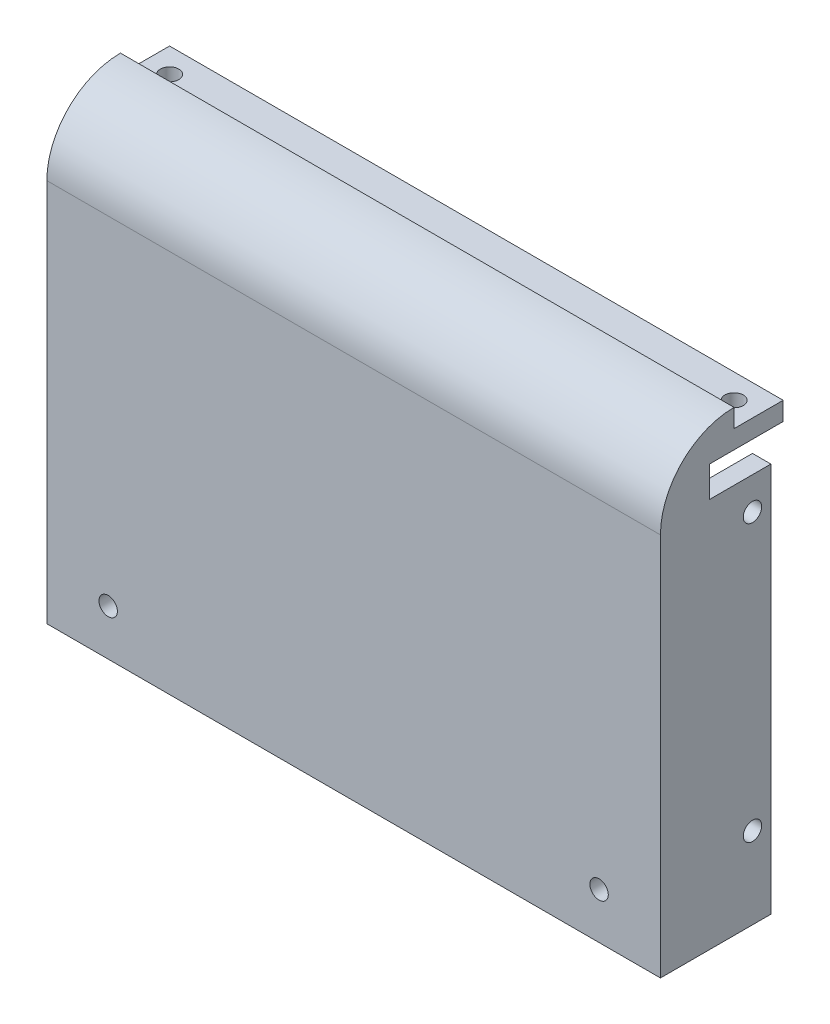
ISO-10303-21;
HEADER;
FILE_DESCRIPTION(('STEP AP214'),'2;1');
FILE_NAME('part.step','',(''),(''),'','','');
FILE_SCHEMA(('AUTOMOTIVE_DESIGN { 1 0 10303 214 1 1 1 1 }'));
ENDSEC;
DATA;
#1=APPLICATION_CONTEXT('core data for automotive mechanical design processes');
#2=APPLICATION_PROTOCOL_DEFINITION('international standard','automotive_design',2000,#1);
#3=PRODUCT_CONTEXT('',#1,'mechanical');
#4=PRODUCT('Part','Part','',(#3));
#5=PRODUCT_RELATED_PRODUCT_CATEGORY('part','',(#4));
#6=PRODUCT_DEFINITION_FORMATION('','',#4);
#7=PRODUCT_DEFINITION_CONTEXT('part definition',#1,'design');
#8=PRODUCT_DEFINITION('design','',#6,#7);
#9=PRODUCT_DEFINITION_SHAPE('','',#8);
#10=(LENGTH_UNIT() NAMED_UNIT(*) SI_UNIT(.MILLI.,.METRE.));
#11=(NAMED_UNIT(*) PLANE_ANGLE_UNIT() SI_UNIT($,.RADIAN.));
#12=(NAMED_UNIT(*) SI_UNIT($,.STERADIAN.) SOLID_ANGLE_UNIT());
#13=UNCERTAINTY_MEASURE_WITH_UNIT(LENGTH_MEASURE(1.E-05),#10,'distance_accuracy_value','');
#14=(GEOMETRIC_REPRESENTATION_CONTEXT(3) GLOBAL_UNCERTAINTY_ASSIGNED_CONTEXT((#13)) GLOBAL_UNIT_ASSIGNED_CONTEXT((#10,
#11,#12)) REPRESENTATION_CONTEXT('',''));
#15=CARTESIAN_POINT('',(0.,0.,0.));
#16=DIRECTION('',(0.,0.,1.));
#17=DIRECTION('',(1.,0.,0.));
#18=AXIS2_PLACEMENT_3D('',#15,#16,#17);
#19=CARTESIAN_POINT('',(-50.,-68.54,7.));
#20=DIRECTION('',(0.,0.,1.));
#21=DIRECTION('',(1.,0.,0.));
#22=AXIS2_PLACEMENT_3D('',#19,#20,#21);
#23=PLANE('',#22);
#24=CARTESIAN_POINT('',(40.,-61.04,7.));
#25=DIRECTION('',(0.,0.,1.));
#26=DIRECTION('',(1.,0.,0.));
#27=AXIS2_PLACEMENT_3D('',#24,#25,#26);
#28=CIRCLE('',#27,1.5);
#29=CARTESIAN_POINT('',(41.5,-61.04,7.));
#30=VERTEX_POINT('',#29);
#31=EDGE_CURVE('E403',#30,#30,#28,.F.);
#32=ORIENTED_EDGE('',*,*,#31,.F.);
#33=EDGE_LOOP('',(#32));
#34=FACE_BOUND('',#33,.T.);
#35=CARTESIAN_POINT('',(-40.,-61.04,7.));
#36=DIRECTION('',(0.,0.,1.));
#37=DIRECTION('',(1.,0.,0.));
#38=AXIS2_PLACEMENT_3D('',#35,#36,#37);
#39=CIRCLE('',#38,1.5);
#40=CARTESIAN_POINT('',(-38.5,-61.04,7.));
#41=VERTEX_POINT('',#40);
#42=EDGE_CURVE('E389',#41,#41,#39,.F.);
#43=ORIENTED_EDGE('',*,*,#42,.F.);
#44=EDGE_LOOP('',(#43));
#45=FACE_BOUND('',#44,.T.);
#46=DIRECTION('',(0.,1.,0.));
#47=VECTOR('',#46,1.);
#48=CARTESIAN_POINT('',(47.,-5.,7.));
#49=LINE('',#48,#47);
#50=CARTESIAN_POINT('',(47.,-68.54,7.));
#51=VERTEX_POINT('',#50);
#52=CARTESIAN_POINT('',(47.,-5.,7.));
#53=VERTEX_POINT('',#52);
#54=EDGE_CURVE('E165',#51,#53,#49,.T.);
#55=ORIENTED_EDGE('',*,*,#54,.F.);
#56=DIRECTION('',(1.,0.,0.));
#57=VECTOR('',#56,1.);
#58=CARTESIAN_POINT('',(-50.,-68.54,7.));
#59=LINE('',#58,#57);
#60=CARTESIAN_POINT('',(-50.,-68.54,7.));
#61=VERTEX_POINT('',#60);
#62=EDGE_CURVE('E148',#61,#51,#59,.T.);
#63=ORIENTED_EDGE('',*,*,#62,.F.);
#64=DIRECTION('',(0.,1.,0.));
#65=VECTOR('',#64,1.);
#66=CARTESIAN_POINT('',(-50.,-68.54,7.));
#67=LINE('',#66,#65);
#68=CARTESIAN_POINT('',(-50.,-5.,7.));
#69=VERTEX_POINT('',#68);
#70=EDGE_CURVE('E233',#61,#69,#67,.T.);
#71=ORIENTED_EDGE('',*,*,#70,.T.);
#72=DIRECTION('',(-1.,0.,0.));
#73=VECTOR('',#72,1.);
#74=CARTESIAN_POINT('',(50.,-5.,7.));
#75=LINE('',#74,#73);
#76=EDGE_CURVE('E202',#53,#69,#75,.T.);
#77=ORIENTED_EDGE('',*,*,#76,.F.);
#78=EDGE_LOOP('',(#55,#63,#71,#77));
#79=FACE_BOUND('',#78,.T.);
#80=ADVANCED_FACE('F42',(#34,#45,#79),#23,.F.);
#81=CARTESIAN_POINT('',(50.,-5.,2.));
#82=DIRECTION('',(0.,1.,0.));
#83=DIRECTION('',(0.,0.,1.));
#84=AXIS2_PLACEMENT_3D('',#81,#82,#83);
#85=PLANE('',#84);
#86=DIRECTION('',(0.,0.,1.));
#87=VECTOR('',#86,1.);
#88=CARTESIAN_POINT('',(47.,-5.,-8.));
#89=LINE('',#88,#87);
#90=CARTESIAN_POINT('',(47.,-5.,2.));
#91=VERTEX_POINT('',#90);
#92=EDGE_CURVE('E181',#91,#53,#89,.T.);
#93=ORIENTED_EDGE('',*,*,#92,.T.);
#94=ORIENTED_EDGE('',*,*,#76,.T.);
#95=DIRECTION('',(0.,0.,1.));
#96=VECTOR('',#95,1.);
#97=CARTESIAN_POINT('',(-50.,-5.,2.));
#98=LINE('',#97,#96);
#99=CARTESIAN_POINT('',(-50.,-5.,2.));
#100=VERTEX_POINT('',#99);
#101=EDGE_CURVE('E220',#100,#69,#98,.T.);
#102=ORIENTED_EDGE('',*,*,#101,.F.);
#103=DIRECTION('',(-1.,0.,0.));
#104=VECTOR('',#103,1.);
#105=CARTESIAN_POINT('',(50.,-5.,2.));
#106=LINE('',#105,#104);
#107=EDGE_CURVE('E207',#91,#100,#106,.T.);
#108=ORIENTED_EDGE('',*,*,#107,.F.);
#109=EDGE_LOOP('',(#93,#94,#102,#108));
#110=FACE_BOUND('',#109,.T.);
#111=ADVANCED_FACE('F294',(#110),#85,.F.);
#112=CARTESIAN_POINT('',(0.,3.,0.));
#113=DIRECTION('',(0.,-1.,0.));
#114=DIRECTION('',(0.,0.,-1.));
#115=AXIS2_PLACEMENT_3D('',#112,#113,#114);
#116=PLANE('',#115);
#117=CARTESIAN_POINT('',(-46.,3.,-6.));
#118=DIRECTION('',(0.,1.,0.));
#119=DIRECTION('',(0.,0.,1.));
#120=AXIS2_PLACEMENT_3D('',#117,#118,#119);
#121=CIRCLE('',#120,1.5);
#122=CARTESIAN_POINT('',(-46.,3.,-4.5));
#123=VERTEX_POINT('',#122);
#124=EDGE_CURVE('E246',#123,#123,#121,.T.);
#125=ORIENTED_EDGE('',*,*,#124,.F.);
#126=EDGE_LOOP('',(#125));
#127=FACE_BOUND('',#126,.T.);
#128=CARTESIAN_POINT('',(46.,3.,-6.));
#129=DIRECTION('',(0.,1.,0.));
#130=DIRECTION('',(0.,0.,1.));
#131=AXIS2_PLACEMENT_3D('',#128,#129,#130);
#132=CIRCLE('',#131,1.5);
#133=CARTESIAN_POINT('',(46.,3.,-4.5));
#134=VERTEX_POINT('',#133);
#135=EDGE_CURVE('E238',#134,#134,#132,.T.);
#136=ORIENTED_EDGE('',*,*,#135,.F.);
#137=EDGE_LOOP('',(#136));
#138=FACE_BOUND('',#137,.T.);
#139=DIRECTION('',(-1.,0.,0.));
#140=VECTOR('',#139,1.);
#141=CARTESIAN_POINT('',(-50.,3.,-2.));
#142=LINE('',#141,#140);
#143=CARTESIAN_POINT('',(50.,3.,-2.));
#144=VERTEX_POINT('',#143);
#145=CARTESIAN_POINT('',(-50.,3.,-2.));
#146=VERTEX_POINT('',#145);
#147=EDGE_CURVE('E186',#144,#146,#142,.T.);
#148=ORIENTED_EDGE('',*,*,#147,.F.);
#149=DIRECTION('',(0.,0.,-1.));
#150=VECTOR('',#149,1.);
#151=CARTESIAN_POINT('',(50.,3.,10.));
#152=LINE('',#151,#150);
#153=CARTESIAN_POINT('',(50.,3.,-10.));
#154=VERTEX_POINT('',#153);
#155=EDGE_CURVE('E254',#144,#154,#152,.T.);
#156=ORIENTED_EDGE('',*,*,#155,.T.);
#157=DIRECTION('',(-1.,0.,0.));
#158=VECTOR('',#157,1.);
#159=CARTESIAN_POINT('',(-50.,3.,-10.));
#160=LINE('',#159,#158);
#161=CARTESIAN_POINT('',(-50.,3.,-10.));
#162=VERTEX_POINT('',#161);
#163=EDGE_CURVE('E257',#154,#162,#160,.T.);
#164=ORIENTED_EDGE('',*,*,#163,.T.);
#165=DIRECTION('',(0.,0.,1.));
#166=VECTOR('',#165,1.);
#167=CARTESIAN_POINT('',(-50.,3.,10.));
#168=LINE('',#167,#166);
#169=EDGE_CURVE('E261',#162,#146,#168,.T.);
#170=ORIENTED_EDGE('',*,*,#169,.T.);
#171=EDGE_LOOP('',(#148,#156,#164,#170));
#172=FACE_BOUND('',#171,.T.);
#173=ADVANCED_FACE('F321',(#127,#138,#172),#116,.F.);
#174=CARTESIAN_POINT('',(50.,3.,10.));
#175=DIRECTION('',(-1.,0.,0.));
#176=DIRECTION('',(0.,0.,1.));
#177=AXIS2_PLACEMENT_3D('',#174,#175,#176);
#178=PLANE('',#177);
#179=CARTESIAN_POINT('',(50.,-10.27,-5.));
#180=DIRECTION('',(1.,0.,0.));
#181=DIRECTION('',(0.,0.,-1.));
#182=AXIS2_PLACEMENT_3D('',#179,#180,#181);
#183=CIRCLE('',#182,1.5);
#184=CARTESIAN_POINT('',(50.,-10.27,-6.5));
#185=VERTEX_POINT('',#184);
#186=EDGE_CURVE('E379',#185,#185,#183,.T.);
#187=ORIENTED_EDGE('',*,*,#186,.F.);
#188=EDGE_LOOP('',(#187));
#189=FACE_BOUND('',#188,.T.);
#190=CARTESIAN_POINT('',(50.,-55.27,-5.));
#191=DIRECTION('',(1.,0.,0.));
#192=DIRECTION('',(0.,0.,-1.));
#193=AXIS2_PLACEMENT_3D('',#190,#191,#192);
#194=CIRCLE('',#193,1.5);
#195=CARTESIAN_POINT('',(50.,-55.27,-6.5));
#196=VERTEX_POINT('',#195);
#197=EDGE_CURVE('E171',#196,#196,#194,.T.);
#198=ORIENTED_EDGE('',*,*,#197,.F.);
#199=EDGE_LOOP('',(#198));
#200=FACE_BOUND('',#199,.T.);
#201=DIRECTION('',(0.,-1.,0.));
#202=VECTOR('',#201,1.);
#203=CARTESIAN_POINT('',(50.,6.,-2.));
#204=LINE('',#203,#202);
#205=CARTESIAN_POINT('',(50.,6.,-2.));
#206=VERTEX_POINT('',#205);
#207=EDGE_CURVE('E198',#206,#144,#204,.T.);
#208=ORIENTED_EDGE('',*,*,#207,.F.);
#209=CARTESIAN_POINT('',(50.,-6.,-2.));
#210=DIRECTION('',(-1.,0.,0.));
#211=DIRECTION('',(0.,0.,1.));
#212=AXIS2_PLACEMENT_3D('',#209,#210,#211);
#213=CIRCLE('',#212,12.);
#214=CARTESIAN_POINT('',(50.,-6.,10.));
#215=VERTEX_POINT('',#214);
#216=EDGE_CURVE('E285',#206,#215,#213,.F.);
#217=ORIENTED_EDGE('',*,*,#216,.T.);
#218=DIRECTION('',(0.,-1.,0.));
#219=VECTOR('',#218,1.);
#220=CARTESIAN_POINT('',(50.,3.,10.));
#221=LINE('',#220,#219);
#222=CARTESIAN_POINT('',(50.,-68.54,10.));
#223=VERTEX_POINT('',#222);
#224=EDGE_CURVE('E142',#215,#223,#221,.T.);
#225=ORIENTED_EDGE('',*,*,#224,.T.);
#226=DIRECTION('',(0.,0.,1.));
#227=VECTOR('',#226,1.);
#228=CARTESIAN_POINT('',(50.,-68.54,10.));
#229=LINE('',#228,#227);
#230=CARTESIAN_POINT('',(50.,-68.54,-8.));
#231=VERTEX_POINT('',#230);
#232=EDGE_CURVE('E135',#231,#223,#229,.T.);
#233=ORIENTED_EDGE('',*,*,#232,.F.);
#234=DIRECTION('',(0.,-1.,0.));
#235=VECTOR('',#234,1.);
#236=CARTESIAN_POINT('',(50.,-5.,-8.));
#237=LINE('',#236,#235);
#238=CARTESIAN_POINT('',(50.,-5.,-8.));
#239=VERTEX_POINT('',#238);
#240=EDGE_CURVE('E141',#239,#231,#237,.T.);
#241=ORIENTED_EDGE('',*,*,#240,.F.);
#242=DIRECTION('',(0.,0.,1.));
#243=VECTOR('',#242,1.);
#244=CARTESIAN_POINT('',(50.,-5.,-8.));
#245=LINE('',#244,#243);
#246=CARTESIAN_POINT('',(50.,-5.,2.));
#247=VERTEX_POINT('',#246);
#248=EDGE_CURVE('E177',#239,#247,#245,.T.);
#249=ORIENTED_EDGE('',*,*,#248,.T.);
#250=DIRECTION('',(0.,-1.,0.));
#251=VECTOR('',#250,1.);
#252=CARTESIAN_POINT('',(50.,0.,2.));
#253=LINE('',#252,#251);
#254=CARTESIAN_POINT('',(50.,0.,2.));
#255=VERTEX_POINT('',#254);
#256=EDGE_CURVE('E203',#255,#247,#253,.T.);
#257=ORIENTED_EDGE('',*,*,#256,.F.);
#258=DIRECTION('',(0.,0.,-1.));
#259=VECTOR('',#258,1.);
#260=CARTESIAN_POINT('',(50.,0.,10.));
#261=LINE('',#260,#259);
#262=CARTESIAN_POINT('',(50.,0.,-10.));
#263=VERTEX_POINT('',#262);
#264=EDGE_CURVE('E250',#255,#263,#261,.T.);
#265=ORIENTED_EDGE('',*,*,#264,.T.);
#266=DIRECTION('',(0.,-1.,0.));
#267=VECTOR('',#266,1.);
#268=CARTESIAN_POINT('',(50.,3.,-10.));
#269=LINE('',#268,#267);
#270=EDGE_CURVE('E281',#154,#263,#269,.T.);
#271=ORIENTED_EDGE('',*,*,#270,.F.);
#272=ORIENTED_EDGE('',*,*,#155,.F.);
#273=EDGE_LOOP('',(#208,#217,#225,#233,#241,#249,#257,#265,#271,#272));
#274=FACE_BOUND('',#273,.T.);
#275=ADVANCED_FACE('F138',(#189,#200,#274),#178,.F.);
#276=CARTESIAN_POINT('',(-50.,3.,-10.));
#277=DIRECTION('',(0.,0.,1.));
#278=DIRECTION('',(1.,0.,0.));
#279=AXIS2_PLACEMENT_3D('',#276,#277,#278);
#280=PLANE('',#279);
#281=DIRECTION('',(-1.,0.,0.));
#282=VECTOR('',#281,1.);
#283=CARTESIAN_POINT('',(-50.,0.,-10.));
#284=LINE('',#283,#282);
#285=CARTESIAN_POINT('',(-50.,0.,-10.));
#286=VERTEX_POINT('',#285);
#287=EDGE_CURVE('E266',#263,#286,#284,.T.);
#288=ORIENTED_EDGE('',*,*,#287,.T.);
#289=DIRECTION('',(0.,-1.,0.));
#290=VECTOR('',#289,1.);
#291=CARTESIAN_POINT('',(-50.,3.,-10.));
#292=LINE('',#291,#290);
#293=EDGE_CURVE('E277',#162,#286,#292,.T.);
#294=ORIENTED_EDGE('',*,*,#293,.F.);
#295=ORIENTED_EDGE('',*,*,#163,.F.);
#296=ORIENTED_EDGE('',*,*,#270,.T.);
#297=EDGE_LOOP('',(#288,#294,#295,#296));
#298=FACE_BOUND('',#297,.T.);
#299=ADVANCED_FACE('F318',(#298),#280,.F.);
#300=CARTESIAN_POINT('',(-50.,3.,10.));
#301=DIRECTION('',(1.,0.,0.));
#302=DIRECTION('',(0.,0.,-1.));
#303=AXIS2_PLACEMENT_3D('',#300,#301,#302);
#304=PLANE('',#303);
#305=DIRECTION('',(0.,-1.,0.));
#306=VECTOR('',#305,1.);
#307=CARTESIAN_POINT('',(-50.,3.,10.));
#308=LINE('',#307,#306);
#309=CARTESIAN_POINT('',(-50.,-6.,10.));
#310=VERTEX_POINT('',#309);
#311=CARTESIAN_POINT('',(-50.,-68.54,10.));
#312=VERTEX_POINT('',#311);
#313=EDGE_CURVE('E274',#310,#312,#308,.T.);
#314=ORIENTED_EDGE('',*,*,#313,.F.);
#315=CARTESIAN_POINT('',(-50.,-6.,-2.));
#316=DIRECTION('',(1.,0.,0.));
#317=DIRECTION('',(0.,0.,-1.));
#318=AXIS2_PLACEMENT_3D('',#315,#316,#317);
#319=CIRCLE('',#318,12.);
#320=CARTESIAN_POINT('',(-50.,6.,-2.));
#321=VERTEX_POINT('',#320);
#322=EDGE_CURVE('E11',#310,#321,#319,.F.);
#323=ORIENTED_EDGE('',*,*,#322,.T.);
#324=DIRECTION('',(0.,-1.,0.));
#325=VECTOR('',#324,1.);
#326=CARTESIAN_POINT('',(-50.,6.,-2.));
#327=LINE('',#326,#325);
#328=EDGE_CURVE('E191',#321,#146,#327,.T.);
#329=ORIENTED_EDGE('',*,*,#328,.T.);
#330=ORIENTED_EDGE('',*,*,#169,.F.);
#331=ORIENTED_EDGE('',*,*,#293,.T.);
#332=DIRECTION('',(0.,0.,1.));
#333=VECTOR('',#332,1.);
#334=CARTESIAN_POINT('',(-50.,0.,10.));
#335=LINE('',#334,#333);
#336=CARTESIAN_POINT('',(-50.,0.,2.));
#337=VERTEX_POINT('',#336);
#338=EDGE_CURVE('E258',#286,#337,#335,.T.);
#339=ORIENTED_EDGE('',*,*,#338,.T.);
#340=DIRECTION('',(0.,1.,0.));
#341=VECTOR('',#340,1.);
#342=CARTESIAN_POINT('',(-50.,0.,2.));
#343=LINE('',#342,#341);
#344=EDGE_CURVE('E212',#100,#337,#343,.T.);
#345=ORIENTED_EDGE('',*,*,#344,.F.);
#346=ORIENTED_EDGE('',*,*,#101,.T.);
#347=ORIENTED_EDGE('',*,*,#70,.F.);
#348=DIRECTION('',(0.,0.,-1.));
#349=VECTOR('',#348,1.);
#350=CARTESIAN_POINT('',(-50.,-68.54,10.));
#351=LINE('',#350,#349);
#352=EDGE_CURVE('E226',#312,#61,#351,.T.);
#353=ORIENTED_EDGE('',*,*,#352,.F.);
#354=EDGE_LOOP('',(#314,#323,#329,#330,#331,#339,#345,#346,#347,#353));
#355=FACE_BOUND('',#354,.T.);
#356=ADVANCED_FACE('F303',(#355),#304,.F.);
#357=CARTESIAN_POINT('',(-50.,3.,10.));
#358=DIRECTION('',(0.,0.,-1.));
#359=DIRECTION('',(-1.,0.,0.));
#360=AXIS2_PLACEMENT_3D('',#357,#358,#359);
#361=PLANE('',#360);
#362=CARTESIAN_POINT('',(40.,-61.04,10.));
#363=DIRECTION('',(0.,0.,1.));
#364=DIRECTION('',(1.,0.,0.));
#365=AXIS2_PLACEMENT_3D('',#362,#363,#364);
#366=CIRCLE('',#365,1.5);
#367=CARTESIAN_POINT('',(41.5,-61.04,10.));
#368=VERTEX_POINT('',#367);
#369=EDGE_CURVE('E407',#368,#368,#366,.T.);
#370=ORIENTED_EDGE('',*,*,#369,.F.);
#371=EDGE_LOOP('',(#370));
#372=FACE_BOUND('',#371,.T.);
#373=CARTESIAN_POINT('',(-40.,-61.04,10.));
#374=DIRECTION('',(0.,0.,1.));
#375=DIRECTION('',(1.,0.,0.));
#376=AXIS2_PLACEMENT_3D('',#373,#374,#375);
#377=CIRCLE('',#376,1.5);
#378=CARTESIAN_POINT('',(-38.5,-61.04,10.));
#379=VERTEX_POINT('',#378);
#380=EDGE_CURVE('E394',#379,#379,#377,.T.);
#381=ORIENTED_EDGE('',*,*,#380,.F.);
#382=EDGE_LOOP('',(#381));
#383=FACE_BOUND('',#382,.T.);
#384=ORIENTED_EDGE('',*,*,#224,.F.);
#385=DIRECTION('',(1.,0.,0.));
#386=VECTOR('',#385,1.);
#387=CARTESIAN_POINT('',(-50.,-6.,10.));
#388=LINE('',#387,#386);
#389=EDGE_CURVE('E51',#215,#310,#388,.F.);
#390=ORIENTED_EDGE('',*,*,#389,.T.);
#391=ORIENTED_EDGE('',*,*,#313,.T.);
#392=DIRECTION('',(-1.,0.,0.));
#393=VECTOR('',#392,1.);
#394=CARTESIAN_POINT('',(-50.,-68.54,10.));
#395=LINE('',#394,#393);
#396=EDGE_CURVE('E147',#223,#312,#395,.T.);
#397=ORIENTED_EDGE('',*,*,#396,.F.);
#398=EDGE_LOOP('',(#384,#390,#391,#397));
#399=FACE_BOUND('',#398,.T.);
#400=ADVANCED_FACE('F328',(#372,#383,#399),#361,.F.);
#401=CARTESIAN_POINT('',(0.,0.,0.));
#402=DIRECTION('',(0.,-1.,0.));
#403=DIRECTION('',(0.,0.,-1.));
#404=AXIS2_PLACEMENT_3D('',#401,#402,#403);
#405=PLANE('',#404);
#406=DIRECTION('',(1.,0.,0.));
#407=VECTOR('',#406,1.);
#408=CARTESIAN_POINT('',(50.,0.,2.));
#409=LINE('',#408,#407);
#410=EDGE_CURVE('E216',#337,#255,#409,.T.);
#411=ORIENTED_EDGE('',*,*,#410,.F.);
#412=ORIENTED_EDGE('',*,*,#338,.F.);
#413=ORIENTED_EDGE('',*,*,#287,.F.);
#414=ORIENTED_EDGE('',*,*,#264,.F.);
#415=EDGE_LOOP('',(#411,#412,#413,#414));
#416=FACE_BOUND('',#415,.T.);
#417=CARTESIAN_POINT('',(46.,0.,-6.));
#418=DIRECTION('',(0.,-1.,0.));
#419=DIRECTION('',(0.,0.,-1.));
#420=AXIS2_PLACEMENT_3D('',#417,#418,#419);
#421=CIRCLE('',#420,1.5);
#422=CARTESIAN_POINT('',(46.,0.,-4.5));
#423=VERTEX_POINT('',#422);
#424=EDGE_CURVE('E237',#423,#423,#421,.F.);
#425=ORIENTED_EDGE('',*,*,#424,.T.);
#426=EDGE_LOOP('',(#425));
#427=FACE_BOUND('',#426,.T.);
#428=CARTESIAN_POINT('',(-46.,0.,-6.));
#429=DIRECTION('',(0.,-1.,0.));
#430=DIRECTION('',(0.,0.,-1.));
#431=AXIS2_PLACEMENT_3D('',#428,#429,#430);
#432=CIRCLE('',#431,1.5);
#433=CARTESIAN_POINT('',(-46.,0.,-4.5));
#434=VERTEX_POINT('',#433);
#435=EDGE_CURVE('E242',#434,#434,#432,.F.);
#436=ORIENTED_EDGE('',*,*,#435,.T.);
#437=EDGE_LOOP('',(#436));
#438=FACE_BOUND('',#437,.T.);
#439=ADVANCED_FACE('F313',(#416,#427,#438),#405,.T.);
#440=CARTESIAN_POINT('',(-46.,-0.00100000000000013,-6.));
#441=DIRECTION('',(0.,1.,0.));
#442=DIRECTION('',(0.,0.,1.));
#443=AXIS2_PLACEMENT_3D('',#440,#441,#442);
#444=CYLINDRICAL_SURFACE('',#443,1.5);
#445=CARTESIAN_POINT('',(-46.,0.,-4.5));
#446=CARTESIAN_POINT('',(-46.,0.03125,-4.5));
#447=CARTESIAN_POINT('',(-46.,0.0625,-4.5));
#448=CARTESIAN_POINT('',(-46.,0.125,-4.5));
#449=CARTESIAN_POINT('',(-46.,0.15625,-4.5));
#450=CARTESIAN_POINT('',(-46.,0.21875,-4.5));
#451=CARTESIAN_POINT('',(-46.,0.25,-4.5));
#452=CARTESIAN_POINT('',(-46.,0.3125,-4.5));
#453=CARTESIAN_POINT('',(-46.,0.34375,-4.5));
#454=CARTESIAN_POINT('',(-46.,0.40625,-4.5));
#455=CARTESIAN_POINT('',(-46.,0.4375,-4.5));
#456=CARTESIAN_POINT('',(-46.,0.5,-4.5));
#457=CARTESIAN_POINT('',(-46.,0.53125,-4.5));
#458=CARTESIAN_POINT('',(-46.,0.59375,-4.5));
#459=CARTESIAN_POINT('',(-46.,0.625,-4.5));
#460=CARTESIAN_POINT('',(-46.,0.6875,-4.5));
#461=CARTESIAN_POINT('',(-46.,0.71875,-4.5));
#462=CARTESIAN_POINT('',(-46.,0.78125,-4.5));
#463=CARTESIAN_POINT('',(-46.,0.8125,-4.5));
#464=CARTESIAN_POINT('',(-46.,0.875,-4.5));
#465=CARTESIAN_POINT('',(-46.,0.90625,-4.5));
#466=CARTESIAN_POINT('',(-46.,0.96875,-4.5));
#467=CARTESIAN_POINT('',(-46.,1.,-4.5));
#468=CARTESIAN_POINT('',(-46.,1.0625,-4.5));
#469=CARTESIAN_POINT('',(-46.,1.09375,-4.5));
#470=CARTESIAN_POINT('',(-46.,1.15625,-4.5));
#471=CARTESIAN_POINT('',(-46.,1.1875,-4.5));
#472=CARTESIAN_POINT('',(-46.,1.25,-4.5));
#473=CARTESIAN_POINT('',(-46.,1.28125,-4.5));
#474=CARTESIAN_POINT('',(-46.,1.34375,-4.5));
#475=CARTESIAN_POINT('',(-46.,1.375,-4.5));
#476=CARTESIAN_POINT('',(-46.,1.4375,-4.5));
#477=CARTESIAN_POINT('',(-46.,1.46875,-4.5));
#478=CARTESIAN_POINT('',(-46.,1.53125,-4.5));
#479=CARTESIAN_POINT('',(-46.,1.5625,-4.5));
#480=CARTESIAN_POINT('',(-46.,1.625,-4.5));
#481=CARTESIAN_POINT('',(-46.,1.65625,-4.5));
#482=CARTESIAN_POINT('',(-46.,1.71875,-4.5));
#483=CARTESIAN_POINT('',(-46.,1.75,-4.5));
#484=CARTESIAN_POINT('',(-46.,1.8125,-4.5));
#485=CARTESIAN_POINT('',(-46.,1.84375,-4.5));
#486=CARTESIAN_POINT('',(-46.,1.90625,-4.5));
#487=CARTESIAN_POINT('',(-46.,1.9375,-4.5));
#488=CARTESIAN_POINT('',(-46.,2.,-4.5));
#489=CARTESIAN_POINT('',(-46.,2.03125,-4.5));
#490=CARTESIAN_POINT('',(-46.,2.09375,-4.5));
#491=CARTESIAN_POINT('',(-46.,2.125,-4.5));
#492=CARTESIAN_POINT('',(-46.,2.1875,-4.5));
#493=CARTESIAN_POINT('',(-46.,2.21875,-4.5));
#494=CARTESIAN_POINT('',(-46.,2.28125,-4.5));
#495=CARTESIAN_POINT('',(-46.,2.3125,-4.5));
#496=CARTESIAN_POINT('',(-46.,2.375,-4.5));
#497=CARTESIAN_POINT('',(-46.,2.40625,-4.5));
#498=CARTESIAN_POINT('',(-46.,2.46875,-4.5));
#499=CARTESIAN_POINT('',(-46.,2.5,-4.5));
#500=CARTESIAN_POINT('',(-46.,2.5625,-4.5));
#501=CARTESIAN_POINT('',(-46.,2.59375,-4.5));
#502=CARTESIAN_POINT('',(-46.,2.65625,-4.5));
#503=CARTESIAN_POINT('',(-46.,2.6875,-4.5));
#504=CARTESIAN_POINT('',(-46.,2.75,-4.5));
#505=CARTESIAN_POINT('',(-46.,2.78125,-4.5));
#506=CARTESIAN_POINT('',(-46.,2.84375,-4.5));
#507=CARTESIAN_POINT('',(-46.,2.875,-4.5));
#508=CARTESIAN_POINT('',(-46.,2.9375,-4.5));
#509=CARTESIAN_POINT('',(-46.,2.96875,-4.5));
#510=CARTESIAN_POINT('',(-46.,3.,-4.5));
#511=B_SPLINE_CURVE_WITH_KNOTS('',3,(#445,#446,#447,#448,#449,#450,#451,#452,#453,#454,#455,
#456,#457,#458,#459,#460,#461,#462,#463,#464,#465,#466,#467,#468,#469,#470,#471,#472,#473,#474,
#475,#476,#477,#478,#479,#480,#481,#482,#483,#484,#485,#486,#487,#488,#489,#490,#491,#492,#493,
#494,#495,#496,#497,#498,#499,#500,#501,#502,#503,#504,#505,#506,#507,#508,#509,#510),
.UNSPECIFIED.,.F.,.F.,(4,2,2,2,2,2,2,2,2,2,2,2,2,2,2,2,2,2,2,2,2,2,2,2,2,2,2,2,2,2,2,2,4),(0.,
0.09375,0.1875,0.28125,0.375,0.46875,0.5625,0.65625,0.75,0.84375,0.9375,1.03125,1.125,1.21875,
1.3125,1.40625,1.5,1.59375,1.6875,1.78125,1.875,1.96875,2.0625,2.15625,2.25,2.34375,2.4375,
2.53125,2.625,2.71875,2.8125,2.90625,3.),.UNSPECIFIED.);
#512=EDGE_CURVE('BSEAM337',#434,#123,#511,.T.);
#513=ORIENTED_EDGE('',*,*,#435,.F.);
#514=ORIENTED_EDGE('',*,*,#124,.T.);
#515=ORIENTED_EDGE('',*,*,#512,.T.);
#516=ORIENTED_EDGE('',*,*,#512,.F.);
#517=EDGE_LOOP('',(#513,#515,#514,#516));
#518=FACE_BOUND('',#517,.T.);
#519=ADVANCED_FACE('F337',(#518),#444,.F.);
#520=CARTESIAN_POINT('',(46.,-0.00100000000000013,-6.));
#521=DIRECTION('',(0.,1.,0.));
#522=DIRECTION('',(0.,0.,1.));
#523=AXIS2_PLACEMENT_3D('',#520,#521,#522);
#524=CYLINDRICAL_SURFACE('',#523,1.5);
#525=CARTESIAN_POINT('',(46.,0.,-4.5));
#526=CARTESIAN_POINT('',(46.,0.03125,-4.5));
#527=CARTESIAN_POINT('',(46.,0.0625,-4.5));
#528=CARTESIAN_POINT('',(46.,0.125,-4.5));
#529=CARTESIAN_POINT('',(46.,0.15625,-4.5));
#530=CARTESIAN_POINT('',(46.,0.21875,-4.5));
#531=CARTESIAN_POINT('',(46.,0.25,-4.5));
#532=CARTESIAN_POINT('',(46.,0.3125,-4.5));
#533=CARTESIAN_POINT('',(46.,0.34375,-4.5));
#534=CARTESIAN_POINT('',(46.,0.40625,-4.5));
#535=CARTESIAN_POINT('',(46.,0.4375,-4.5));
#536=CARTESIAN_POINT('',(46.,0.5,-4.5));
#537=CARTESIAN_POINT('',(46.,0.53125,-4.5));
#538=CARTESIAN_POINT('',(46.,0.59375,-4.5));
#539=CARTESIAN_POINT('',(46.,0.625,-4.5));
#540=CARTESIAN_POINT('',(46.,0.6875,-4.5));
#541=CARTESIAN_POINT('',(46.,0.71875,-4.5));
#542=CARTESIAN_POINT('',(46.,0.78125,-4.5));
#543=CARTESIAN_POINT('',(46.,0.8125,-4.5));
#544=CARTESIAN_POINT('',(46.,0.875,-4.5));
#545=CARTESIAN_POINT('',(46.,0.90625,-4.5));
#546=CARTESIAN_POINT('',(46.,0.96875,-4.5));
#547=CARTESIAN_POINT('',(46.,1.,-4.5));
#548=CARTESIAN_POINT('',(46.,1.0625,-4.5));
#549=CARTESIAN_POINT('',(46.,1.09375,-4.5));
#550=CARTESIAN_POINT('',(46.,1.15625,-4.5));
#551=CARTESIAN_POINT('',(46.,1.1875,-4.5));
#552=CARTESIAN_POINT('',(46.,1.25,-4.5));
#553=CARTESIAN_POINT('',(46.,1.28125,-4.5));
#554=CARTESIAN_POINT('',(46.,1.34375,-4.5));
#555=CARTESIAN_POINT('',(46.,1.375,-4.5));
#556=CARTESIAN_POINT('',(46.,1.4375,-4.5));
#557=CARTESIAN_POINT('',(46.,1.46875,-4.5));
#558=CARTESIAN_POINT('',(46.,1.53125,-4.5));
#559=CARTESIAN_POINT('',(46.,1.5625,-4.5));
#560=CARTESIAN_POINT('',(46.,1.625,-4.5));
#561=CARTESIAN_POINT('',(46.,1.65625,-4.5));
#562=CARTESIAN_POINT('',(46.,1.71875,-4.5));
#563=CARTESIAN_POINT('',(46.,1.75,-4.5));
#564=CARTESIAN_POINT('',(46.,1.8125,-4.5));
#565=CARTESIAN_POINT('',(46.,1.84375,-4.5));
#566=CARTESIAN_POINT('',(46.,1.90625,-4.5));
#567=CARTESIAN_POINT('',(46.,1.9375,-4.5));
#568=CARTESIAN_POINT('',(46.,2.,-4.5));
#569=CARTESIAN_POINT('',(46.,2.03125,-4.5));
#570=CARTESIAN_POINT('',(46.,2.09375,-4.5));
#571=CARTESIAN_POINT('',(46.,2.125,-4.5));
#572=CARTESIAN_POINT('',(46.,2.1875,-4.5));
#573=CARTESIAN_POINT('',(46.,2.21875,-4.5));
#574=CARTESIAN_POINT('',(46.,2.28125,-4.5));
#575=CARTESIAN_POINT('',(46.,2.3125,-4.5));
#576=CARTESIAN_POINT('',(46.,2.375,-4.5));
#577=CARTESIAN_POINT('',(46.,2.40625,-4.5));
#578=CARTESIAN_POINT('',(46.,2.46875,-4.5));
#579=CARTESIAN_POINT('',(46.,2.5,-4.5));
#580=CARTESIAN_POINT('',(46.,2.5625,-4.5));
#581=CARTESIAN_POINT('',(46.,2.59375,-4.5));
#582=CARTESIAN_POINT('',(46.,2.65625,-4.5));
#583=CARTESIAN_POINT('',(46.,2.6875,-4.5));
#584=CARTESIAN_POINT('',(46.,2.75,-4.5));
#585=CARTESIAN_POINT('',(46.,2.78125,-4.5));
#586=CARTESIAN_POINT('',(46.,2.84375,-4.5));
#587=CARTESIAN_POINT('',(46.,2.875,-4.5));
#588=CARTESIAN_POINT('',(46.,2.9375,-4.5));
#589=CARTESIAN_POINT('',(46.,2.96875,-4.5));
#590=CARTESIAN_POINT('',(46.,3.,-4.5));
#591=B_SPLINE_CURVE_WITH_KNOTS('',3,(#525,#526,#527,#528,#529,#530,#531,#532,#533,#534,#535,
#536,#537,#538,#539,#540,#541,#542,#543,#544,#545,#546,#547,#548,#549,#550,#551,#552,#553,#554,
#555,#556,#557,#558,#559,#560,#561,#562,#563,#564,#565,#566,#567,#568,#569,#570,#571,#572,#573,
#574,#575,#576,#577,#578,#579,#580,#581,#582,#583,#584,#585,#586,#587,#588,#589,#590),
.UNSPECIFIED.,.F.,.F.,(4,2,2,2,2,2,2,2,2,2,2,2,2,2,2,2,2,2,2,2,2,2,2,2,2,2,2,2,2,2,2,2,4),(0.,
0.09375,0.1875,0.28125,0.375,0.46875,0.5625,0.65625,0.75,0.84375,0.9375,1.03125,1.125,1.21875,
1.3125,1.40625,1.5,1.59375,1.6875,1.78125,1.875,1.96875,2.0625,2.15625,2.25,2.34375,2.4375,
2.53125,2.625,2.71875,2.8125,2.90625,3.),.UNSPECIFIED.);
#592=EDGE_CURVE('BSEAM354',#423,#134,#591,.T.);
#593=ORIENTED_EDGE('',*,*,#424,.F.);
#594=ORIENTED_EDGE('',*,*,#135,.T.);
#595=ORIENTED_EDGE('',*,*,#592,.T.);
#596=ORIENTED_EDGE('',*,*,#592,.F.);
#597=EDGE_LOOP('',(#593,#595,#594,#596));
#598=FACE_BOUND('',#597,.T.);
#599=ADVANCED_FACE('F354',(#598),#524,.F.);
#600=CARTESIAN_POINT('',(0.,-68.54,0.));
#601=DIRECTION('',(0.,-1.,0.));
#602=DIRECTION('',(0.,0.,-1.));
#603=AXIS2_PLACEMENT_3D('',#600,#601,#602);
#604=PLANE('',#603);
#605=ORIENTED_EDGE('',*,*,#352,.T.);
#606=ORIENTED_EDGE('',*,*,#62,.T.);
#607=DIRECTION('',(0.,0.,1.));
#608=VECTOR('',#607,1.);
#609=CARTESIAN_POINT('',(47.,-68.54,-8.));
#610=LINE('',#609,#608);
#611=CARTESIAN_POINT('',(47.,-68.54,-8.));
#612=VERTEX_POINT('',#611);
#613=EDGE_CURVE('E155',#612,#51,#610,.T.);
#614=ORIENTED_EDGE('',*,*,#613,.F.);
#615=DIRECTION('',(-1.,0.,0.));
#616=VECTOR('',#615,1.);
#617=CARTESIAN_POINT('',(50.,-68.54,-8.));
#618=LINE('',#617,#616);
#619=EDGE_CURVE('E151',#231,#612,#618,.T.);
#620=ORIENTED_EDGE('',*,*,#619,.F.);
#621=ORIENTED_EDGE('',*,*,#232,.T.);
#622=ORIENTED_EDGE('',*,*,#396,.T.);
#623=EDGE_LOOP('',(#605,#606,#614,#620,#621,#622));
#624=FACE_BOUND('',#623,.T.);
#625=ADVANCED_FACE('F153',(#624),#604,.T.);
#626=CARTESIAN_POINT('',(0.,0.,2.));
#627=DIRECTION('',(0.,0.,-1.));
#628=DIRECTION('',(-1.,0.,0.));
#629=AXIS2_PLACEMENT_3D('',#626,#627,#628);
#630=PLANE('',#629);
#631=ORIENTED_EDGE('',*,*,#256,.T.);
#632=EDGE_CURVE('E208',#247,#91,#106,.T.);
#633=ORIENTED_EDGE('',*,*,#632,.T.);
#634=ORIENTED_EDGE('',*,*,#107,.T.);
#635=ORIENTED_EDGE('',*,*,#344,.T.);
#636=ORIENTED_EDGE('',*,*,#410,.T.);
#637=EDGE_LOOP('',(#631,#633,#634,#635,#636));
#638=FACE_BOUND('',#637,.T.);
#639=ADVANCED_FACE('F306',(#638),#630,.T.);
#640=CARTESIAN_POINT('',(-50.,6.,-2.));
#641=DIRECTION('',(0.,0.,1.));
#642=DIRECTION('',(1.,0.,0.));
#643=AXIS2_PLACEMENT_3D('',#640,#641,#642);
#644=PLANE('',#643);
#645=ORIENTED_EDGE('',*,*,#147,.T.);
#646=ORIENTED_EDGE('',*,*,#328,.F.);
#647=DIRECTION('',(-1.,0.,0.));
#648=VECTOR('',#647,1.);
#649=CARTESIAN_POINT('',(-50.,6.,-2.));
#650=LINE('',#649,#648);
#651=EDGE_CURVE('E187',#206,#321,#650,.T.);
#652=ORIENTED_EDGE('',*,*,#651,.F.);
#653=ORIENTED_EDGE('',*,*,#207,.T.);
#654=EDGE_LOOP('',(#645,#646,#652,#653));
#655=FACE_BOUND('',#654,.T.);
#656=ADVANCED_FACE('F324',(#655),#644,.F.);
#657=CARTESIAN_POINT('',(0.,-6.,-2.));
#658=DIRECTION('',(1.,0.,0.));
#659=DIRECTION('',(0.,0.,-1.));
#660=AXIS2_PLACEMENT_3D('',#657,#658,#659);
#661=CYLINDRICAL_SURFACE('',#660,12.);
#662=ORIENTED_EDGE('',*,*,#322,.F.);
#663=ORIENTED_EDGE('',*,*,#389,.F.);
#664=ORIENTED_EDGE('',*,*,#216,.F.);
#665=ORIENTED_EDGE('',*,*,#651,.T.);
#666=EDGE_LOOP('',(#662,#663,#664,#665));
#667=FACE_BOUND('',#666,.T.);
#668=ADVANCED_FACE('F44',(#667),#661,.T.);
#669=CARTESIAN_POINT('',(47.,-5.,-8.));
#670=DIRECTION('',(1.,0.,0.));
#671=DIRECTION('',(0.,1.,0.));
#672=AXIS2_PLACEMENT_3D('',#669,#670,#671);
#673=PLANE('',#672);
#674=CARTESIAN_POINT('',(47.,-10.27,-5.));
#675=DIRECTION('',(1.,0.,0.));
#676=DIRECTION('',(0.,1.,0.));
#677=AXIS2_PLACEMENT_3D('',#674,#675,#676);
#678=CIRCLE('',#677,1.5);
#679=CARTESIAN_POINT('',(47.,-8.77,-5.));
#680=VERTEX_POINT('',#679);
#681=EDGE_CURVE('E168',#680,#680,#678,.F.);
#682=ORIENTED_EDGE('',*,*,#681,.F.);
#683=EDGE_LOOP('',(#682));
#684=FACE_BOUND('',#683,.T.);
#685=CARTESIAN_POINT('',(47.,-55.27,-5.));
#686=DIRECTION('',(1.,0.,0.));
#687=DIRECTION('',(0.,1.,0.));
#688=AXIS2_PLACEMENT_3D('',#685,#686,#687);
#689=CIRCLE('',#688,1.5);
#690=CARTESIAN_POINT('',(47.,-53.77,-5.));
#691=VERTEX_POINT('',#690);
#692=EDGE_CURVE('E384',#691,#691,#689,.F.);
#693=ORIENTED_EDGE('',*,*,#692,.F.);
#694=EDGE_LOOP('',(#693));
#695=FACE_BOUND('',#694,.T.);
#696=ORIENTED_EDGE('',*,*,#54,.T.);
#697=ORIENTED_EDGE('',*,*,#92,.F.);
#698=CARTESIAN_POINT('',(47.,-5.,-8.));
#699=VERTEX_POINT('',#698);
#700=EDGE_CURVE('E58',#699,#91,#89,.T.);
#701=ORIENTED_EDGE('',*,*,#700,.F.);
#702=DIRECTION('',(0.,1.,0.));
#703=VECTOR('',#702,1.);
#704=CARTESIAN_POINT('',(47.,-5.,-8.));
#705=LINE('',#704,#703);
#706=EDGE_CURVE('E159',#612,#699,#705,.T.);
#707=ORIENTED_EDGE('',*,*,#706,.F.);
#708=ORIENTED_EDGE('',*,*,#613,.T.);
#709=EDGE_LOOP('',(#696,#697,#701,#707,#708));
#710=FACE_BOUND('',#709,.T.);
#711=ADVANCED_FACE('F432',(#684,#695,#710),#673,.F.);
#712=CARTESIAN_POINT('',(50.,-5.,-8.));
#713=DIRECTION('',(0.,-1.,0.));
#714=DIRECTION('',(0.,0.,-1.));
#715=AXIS2_PLACEMENT_3D('',#712,#713,#714);
#716=PLANE('',#715);
#717=ORIENTED_EDGE('',*,*,#632,.F.);
#718=ORIENTED_EDGE('',*,*,#248,.F.);
#719=DIRECTION('',(1.,0.,0.));
#720=VECTOR('',#719,1.);
#721=CARTESIAN_POINT('',(50.,-5.,-8.));
#722=LINE('',#721,#720);
#723=EDGE_CURVE('E162',#699,#239,#722,.T.);
#724=ORIENTED_EDGE('',*,*,#723,.F.);
#725=ORIENTED_EDGE('',*,*,#700,.T.);
#726=EDGE_LOOP('',(#717,#718,#724,#725));
#727=FACE_BOUND('',#726,.T.);
#728=ADVANCED_FACE('F308',(#727),#716,.F.);
#729=CARTESIAN_POINT('',(0.,0.,-8.));
#730=DIRECTION('',(0.,0.,-1.));
#731=DIRECTION('',(-1.,0.,0.));
#732=AXIS2_PLACEMENT_3D('',#729,#730,#731);
#733=PLANE('',#732);
#734=ORIENTED_EDGE('',*,*,#240,.T.);
#735=ORIENTED_EDGE('',*,*,#619,.T.);
#736=ORIENTED_EDGE('',*,*,#706,.T.);
#737=ORIENTED_EDGE('',*,*,#723,.T.);
#738=EDGE_LOOP('',(#734,#735,#736,#737));
#739=FACE_BOUND('',#738,.T.);
#740=ADVANCED_FACE('F161',(#739),#733,.T.);
#741=CARTESIAN_POINT('',(-50.001,-55.27,-5.));
#742=DIRECTION('',(1.,0.,0.));
#743=DIRECTION('',(0.,0.,-1.));
#744=AXIS2_PLACEMENT_3D('',#741,#742,#743);
#745=CYLINDRICAL_SURFACE('',#744,1.5);
#746=ORIENTED_EDGE('',*,*,#197,.T.);
#747=EDGE_LOOP('',(#746));
#748=FACE_BOUND('',#747,.T.);
#749=ORIENTED_EDGE('',*,*,#692,.T.);
#750=EDGE_LOOP('',(#749));
#751=FACE_BOUND('',#750,.T.);
#752=ADVANCED_FACE('F424',(#748,#751),#745,.F.);
#753=CARTESIAN_POINT('',(-50.001,-10.27,-5.));
#754=DIRECTION('',(1.,0.,0.));
#755=DIRECTION('',(0.,0.,-1.));
#756=AXIS2_PLACEMENT_3D('',#753,#754,#755);
#757=CYLINDRICAL_SURFACE('',#756,1.5);
#758=ORIENTED_EDGE('',*,*,#186,.T.);
#759=EDGE_LOOP('',(#758));
#760=FACE_BOUND('',#759,.T.);
#761=ORIENTED_EDGE('',*,*,#681,.T.);
#762=EDGE_LOOP('',(#761));
#763=FACE_BOUND('',#762,.T.);
#764=ADVANCED_FACE('F418',(#760,#763),#757,.F.);
#765=CARTESIAN_POINT('',(-40.,-61.04,-10.001));
#766=DIRECTION('',(0.,0.,1.));
#767=DIRECTION('',(1.,0.,0.));
#768=AXIS2_PLACEMENT_3D('',#765,#766,#767);
#769=CYLINDRICAL_SURFACE('',#768,1.5);
#770=ORIENTED_EDGE('',*,*,#380,.T.);
#771=EDGE_LOOP('',(#770));
#772=FACE_BOUND('',#771,.T.);
#773=ORIENTED_EDGE('',*,*,#42,.T.);
#774=EDGE_LOOP('',(#773));
#775=FACE_BOUND('',#774,.T.);
#776=ADVANCED_FACE('F414',(#772,#775),#769,.F.);
#777=CARTESIAN_POINT('',(40.,-61.04,-10.001));
#778=DIRECTION('',(0.,0.,1.));
#779=DIRECTION('',(1.,0.,0.));
#780=AXIS2_PLACEMENT_3D('',#777,#778,#779);
#781=CYLINDRICAL_SURFACE('',#780,1.5);
#782=ORIENTED_EDGE('',*,*,#369,.T.);
#783=EDGE_LOOP('',(#782));
#784=FACE_BOUND('',#783,.T.);
#785=ORIENTED_EDGE('',*,*,#31,.T.);
#786=EDGE_LOOP('',(#785));
#787=FACE_BOUND('',#786,.T.);
#788=ADVANCED_FACE('F411',(#784,#787),#781,.F.);
#789=CLOSED_SHELL('',(#80,#111,#173,#275,#299,#356,#400,#439,#519,#599,#625,#639,#656,#668,#711,
#728,#740,#752,#764,#776,#788));
#790=MANIFOLD_SOLID_BREP('B2',#789);
#791=ADVANCED_BREP_SHAPE_REPRESENTATION('',(#18,#790),#14);
#792=SHAPE_DEFINITION_REPRESENTATION(#9,#791);
ENDSEC;
END-ISO-10303-21;
